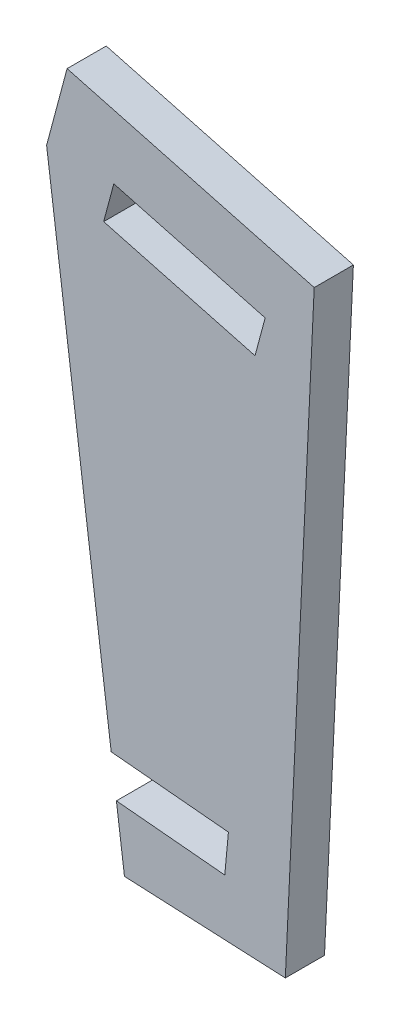
ISO-10303-21;
HEADER;
FILE_DESCRIPTION(('STEP AP214'),'2;1');
FILE_NAME('part.step','',(''),(''),'','','');
FILE_SCHEMA(('AUTOMOTIVE_DESIGN { 1 0 10303 214 1 1 1 1 }'));
ENDSEC;
DATA;
#1=APPLICATION_CONTEXT('core data for automotive mechanical design processes');
#2=APPLICATION_PROTOCOL_DEFINITION('international standard','automotive_design',2000,#1);
#3=PRODUCT_CONTEXT('',#1,'mechanical');
#4=PRODUCT('Part','Part','',(#3));
#5=PRODUCT_RELATED_PRODUCT_CATEGORY('part','',(#4));
#6=PRODUCT_DEFINITION_FORMATION('','',#4);
#7=PRODUCT_DEFINITION_CONTEXT('part definition',#1,'design');
#8=PRODUCT_DEFINITION('design','',#6,#7);
#9=PRODUCT_DEFINITION_SHAPE('','',#8);
#10=(LENGTH_UNIT() NAMED_UNIT(*) SI_UNIT(.MILLI.,.METRE.));
#11=(NAMED_UNIT(*) PLANE_ANGLE_UNIT() SI_UNIT($,.RADIAN.));
#12=(NAMED_UNIT(*) SI_UNIT($,.STERADIAN.) SOLID_ANGLE_UNIT());
#13=UNCERTAINTY_MEASURE_WITH_UNIT(LENGTH_MEASURE(1.E-05),#10,'distance_accuracy_value','');
#14=(GEOMETRIC_REPRESENTATION_CONTEXT(3) GLOBAL_UNCERTAINTY_ASSIGNED_CONTEXT((#13)) GLOBAL_UNIT_ASSIGNED_CONTEXT((#10,
#11,#12)) REPRESENTATION_CONTEXT('',''));
#15=CARTESIAN_POINT('',(0.,0.,0.));
#16=DIRECTION('',(0.,0.,1.));
#17=DIRECTION('',(1.,0.,0.));
#18=AXIS2_PLACEMENT_3D('',#15,#16,#17);
#19=CARTESIAN_POINT('',(157.617642361684,-51.1140319191519,2.99999999999999));
#20=DIRECTION('',(0.,0.,1.));
#21=DIRECTION('',(1.,0.,0.));
#22=AXIS2_PLACEMENT_3D('',#19,#20,#21);
#23=PLANE('',#22);
#24=DIRECTION('',(-0.258148367072537,-0.966105284416654,0.));
#25=VECTOR('',#24,1.);
#26=CARTESIAN_POINT('',(157.617642361684,-51.1140319191519,2.99999999999999));
#27=LINE('',#26,#25);
#28=CARTESIAN_POINT('',(157.617642361684,-51.1140319191519,2.99999999999999));
#29=VERTEX_POINT('',#28);
#30=CARTESIAN_POINT('',(156.049697038007,-56.9819763112041,2.99999999999999));
#31=VERTEX_POINT('',#30);
#32=EDGE_CURVE('E181',#29,#31,#27,.T.);
#33=ORIENTED_EDGE('',*,*,#32,.T.);
#34=DIRECTION('',(0.129889408624981,-0.99152848750152,0.));
#35=VECTOR('',#34,1.);
#36=CARTESIAN_POINT('',(156.049697038007,-56.9819763112041,2.99999999999999));
#37=LINE('',#36,#35);
#38=CARTESIAN_POINT('',(160.995963780606,-94.7399770133879,2.99999999999999));
#39=VERTEX_POINT('',#38);
#40=EDGE_CURVE('E184',#31,#39,#37,.T.);
#41=ORIENTED_EDGE('',*,*,#40,.T.);
#42=DIRECTION('',(0.995686561882044,-0.0927807657196007,0.));
#43=VECTOR('',#42,1.);
#44=CARTESIAN_POINT('',(160.995963780606,-94.7399770133879,2.99999999999999));
#45=LINE('',#44,#43);
#46=CARTESIAN_POINT('',(169.973055579343,-95.5764866971659,3.00000000000001));
#47=VERTEX_POINT('',#46);
#48=EDGE_CURVE('E186',#39,#47,#45,.T.);
#49=ORIENTED_EDGE('',*,*,#48,.T.);
#50=DIRECTION('',(-0.0927807657196038,-0.995686561882043,0.));
#51=VECTOR('',#50,1.);
#52=CARTESIAN_POINT('',(169.973055579343,-95.5764866971659,3.00000000000001));
#53=LINE('',#52,#51);
#54=CARTESIAN_POINT('',(169.694713282184,-98.563546382812,3.00000000000001));
#55=VERTEX_POINT('',#54);
#56=EDGE_CURVE('E188',#47,#55,#53,.T.);
#57=ORIENTED_EDGE('',*,*,#56,.T.);
#58=DIRECTION('',(-0.995686561882044,0.0927807657195996,0.));
#59=VECTOR('',#58,1.);
#60=CARTESIAN_POINT('',(161.395541390582,-97.7902071087678,3.));
#61=LINE('',#60,#59);
#62=CARTESIAN_POINT('',(161.395541390582,-97.7902071087678,3.));
#63=VERTEX_POINT('',#62);
#64=EDGE_CURVE('E190',#55,#63,#61,.T.);
#65=ORIENTED_EDGE('',*,*,#64,.T.);
#66=DIRECTION('',(0.129889408624976,-0.991528487501521,0.));
#67=VECTOR('',#66,1.);
#68=CARTESIAN_POINT('',(161.395541390582,-97.7902071087678,3.));
#69=LINE('',#68,#67);
#70=CARTESIAN_POINT('',(162.011434279497,-102.491709341116,3.));
#71=VERTEX_POINT('',#70);
#72=EDGE_CURVE('E192',#63,#71,#69,.T.);
#73=ORIENTED_EDGE('',*,*,#72,.T.);
#74=DIRECTION('',(0.998889332583097,-0.0471179504190949,0.));
#75=VECTOR('',#74,1.);
#76=CARTESIAN_POINT('',(174.332527403934,-103.072899505041,3.));
#77=LINE('',#76,#75);
#78=CARTESIAN_POINT('',(174.332527403934,-103.072899505041,3.));
#79=VERTEX_POINT('',#78);
#80=EDGE_CURVE('E194',#71,#79,#77,.T.);
#81=ORIENTED_EDGE('',*,*,#80,.T.);
#82=DIRECTION('',(0.0471179504190919,0.998889332583096,0.));
#83=VECTOR('',#82,1.);
#84=CARTESIAN_POINT('',(176.544882918593,-56.171489239557,2.99999999999999));
#85=LINE('',#84,#83);
#86=CARTESIAN_POINT('',(176.544882918593,-56.171489239557,2.99999999999999));
#87=VERTEX_POINT('',#86);
#88=EDGE_CURVE('E196',#79,#87,#85,.T.);
#89=ORIENTED_EDGE('',*,*,#88,.T.);
#90=DIRECTION('',(-0.966105284416654,0.258148367072538,0.));
#91=VECTOR('',#90,1.);
#92=CARTESIAN_POINT('',(157.617642361684,-51.1140319191519,2.99999999999999));
#93=LINE('',#92,#91);
#94=EDGE_CURVE('E198',#87,#29,#93,.T.);
#95=ORIENTED_EDGE('',*,*,#94,.T.);
#96=EDGE_LOOP('',(#33,#41,#49,#57,#65,#73,#81,#89,#95));
#97=FACE_BOUND('',#96,.T.);
#98=DIRECTION('',(0.966105284416653,-0.258148367072539,0.));
#99=VECTOR('',#98,1.);
#100=CARTESIAN_POINT('',(160.419784951868,-59.862246689487,2.99999999999999));
#101=LINE('',#100,#99);
#102=CARTESIAN_POINT('',(160.419784951868,-59.862246689487,2.99999999999999));
#103=VERTEX_POINT('',#102);
#104=CARTESIAN_POINT('',(172.013048364868,-62.9600270943576,3.00000000000001));
#105=VERTEX_POINT('',#104);
#106=EDGE_CURVE('E153',#103,#105,#101,.T.);
#107=ORIENTED_EDGE('',*,*,#106,.F.);
#108=DIRECTION('',(-0.258148367072543,-0.966105284416652,0.));
#109=VECTOR('',#108,1.);
#110=CARTESIAN_POINT('',(161.194230053086,-56.9639308362371,2.99999999999998));
#111=LINE('',#110,#109);
#112=CARTESIAN_POINT('',(161.194230053086,-56.9639308362371,2.99999999999998));
#113=VERTEX_POINT('',#112);
#114=EDGE_CURVE('E142',#113,#103,#111,.T.);
#115=ORIENTED_EDGE('',*,*,#114,.F.);
#116=DIRECTION('',(-0.966105284416653,0.258148367072539,0.));
#117=VECTOR('',#116,1.);
#118=CARTESIAN_POINT('',(172.787493466086,-60.0617112411076,3.00000000000001));
#119=LINE('',#118,#117);
#120=CARTESIAN_POINT('',(172.787493466086,-60.0617112411076,3.00000000000001));
#121=VERTEX_POINT('',#120);
#122=EDGE_CURVE('E157',#121,#113,#119,.T.);
#123=ORIENTED_EDGE('',*,*,#122,.F.);
#124=DIRECTION('',(0.258148367072534,0.966105284416654,0.));
#125=VECTOR('',#124,1.);
#126=CARTESIAN_POINT('',(172.013048364868,-62.9600270943576,3.00000000000001));
#127=LINE('',#126,#125);
#128=EDGE_CURVE('E155',#105,#121,#127,.T.);
#129=ORIENTED_EDGE('',*,*,#128,.F.);
#130=EDGE_LOOP('',(#107,#115,#123,#129));
#131=FACE_BOUND('',#130,.T.);
#132=ADVANCED_FACE('F32',(#97,#131),#23,.T.);
#133=CARTESIAN_POINT('',(157.617642361684,-51.1140319191519,0.));
#134=DIRECTION('',(0.,0.,1.));
#135=DIRECTION('',(1.,0.,0.));
#136=AXIS2_PLACEMENT_3D('',#133,#134,#135);
#137=PLANE('',#136);
#138=DIRECTION('',(-0.258148367072537,-0.966105284416654,0.));
#139=VECTOR('',#138,1.);
#140=CARTESIAN_POINT('',(157.617642361684,-51.1140319191519,0.));
#141=LINE('',#140,#139);
#142=CARTESIAN_POINT('',(157.617642361684,-51.1140319191519,0.));
#143=VERTEX_POINT('',#142);
#144=CARTESIAN_POINT('',(156.049697038007,-56.9819763112042,0.));
#145=VERTEX_POINT('',#144);
#146=EDGE_CURVE('E143',#143,#145,#141,.T.);
#147=ORIENTED_EDGE('',*,*,#146,.F.);
#148=DIRECTION('',(-0.966105284416654,0.258148367072538,0.));
#149=VECTOR('',#148,1.);
#150=CARTESIAN_POINT('',(157.617642361684,-51.1140319191519,0.));
#151=LINE('',#150,#149);
#152=CARTESIAN_POINT('',(176.544882918593,-56.171489239557,0.));
#153=VERTEX_POINT('',#152);
#154=EDGE_CURVE('E179',#153,#143,#151,.T.);
#155=ORIENTED_EDGE('',*,*,#154,.F.);
#156=DIRECTION('',(0.0471179504190919,0.998889332583096,0.));
#157=VECTOR('',#156,1.);
#158=CARTESIAN_POINT('',(176.544882918593,-56.171489239557,0.));
#159=LINE('',#158,#157);
#160=CARTESIAN_POINT('',(174.332527403934,-103.072899505041,0.));
#161=VERTEX_POINT('',#160);
#162=EDGE_CURVE('E177',#161,#153,#159,.T.);
#163=ORIENTED_EDGE('',*,*,#162,.F.);
#164=DIRECTION('',(0.998889332583097,-0.0471179504190949,0.));
#165=VECTOR('',#164,1.);
#166=CARTESIAN_POINT('',(174.332527403934,-103.072899505041,0.));
#167=LINE('',#166,#165);
#168=CARTESIAN_POINT('',(162.011434279497,-102.491709341116,0.));
#169=VERTEX_POINT('',#168);
#170=EDGE_CURVE('E175',#169,#161,#167,.T.);
#171=ORIENTED_EDGE('',*,*,#170,.F.);
#172=DIRECTION('',(0.129889408624976,-0.991528487501521,0.));
#173=VECTOR('',#172,1.);
#174=CARTESIAN_POINT('',(161.395541390582,-97.7902071087678,0.));
#175=LINE('',#174,#173);
#176=CARTESIAN_POINT('',(161.395541390582,-97.7902071087678,0.));
#177=VERTEX_POINT('',#176);
#178=EDGE_CURVE('E173',#177,#169,#175,.T.);
#179=ORIENTED_EDGE('',*,*,#178,.F.);
#180=DIRECTION('',(-0.995686561882044,0.0927807657195996,0.));
#181=VECTOR('',#180,1.);
#182=CARTESIAN_POINT('',(161.395541390582,-97.7902071087678,0.));
#183=LINE('',#182,#181);
#184=CARTESIAN_POINT('',(169.694713282184,-98.563546382812,0.));
#185=VERTEX_POINT('',#184);
#186=EDGE_CURVE('E171',#185,#177,#183,.T.);
#187=ORIENTED_EDGE('',*,*,#186,.F.);
#188=DIRECTION('',(-0.0927807657196038,-0.995686561882043,0.));
#189=VECTOR('',#188,1.);
#190=CARTESIAN_POINT('',(169.973055579343,-95.5764866971659,0.));
#191=LINE('',#190,#189);
#192=CARTESIAN_POINT('',(169.973055579343,-95.5764866971659,0.));
#193=VERTEX_POINT('',#192);
#194=EDGE_CURVE('E169',#193,#185,#191,.T.);
#195=ORIENTED_EDGE('',*,*,#194,.F.);
#196=DIRECTION('',(0.995686561882044,-0.0927807657196007,0.));
#197=VECTOR('',#196,1.);
#198=CARTESIAN_POINT('',(160.995963780606,-94.7399770133879,0.));
#199=LINE('',#198,#197);
#200=CARTESIAN_POINT('',(160.995963780606,-94.7399770133879,0.));
#201=VERTEX_POINT('',#200);
#202=EDGE_CURVE('E167',#201,#193,#199,.T.);
#203=ORIENTED_EDGE('',*,*,#202,.F.);
#204=DIRECTION('',(0.129889408624981,-0.99152848750152,0.));
#205=VECTOR('',#204,1.);
#206=CARTESIAN_POINT('',(156.049697038007,-56.9819763112042,0.));
#207=LINE('',#206,#205);
#208=EDGE_CURVE('E165',#145,#201,#207,.T.);
#209=ORIENTED_EDGE('',*,*,#208,.F.);
#210=EDGE_LOOP('',(#147,#155,#163,#171,#179,#187,#195,#203,#209));
#211=FACE_BOUND('',#210,.T.);
#212=DIRECTION('',(-0.258148367072543,-0.966105284416652,0.));
#213=VECTOR('',#212,1.);
#214=CARTESIAN_POINT('',(161.194230053086,-56.9639308362371,0.));
#215=LINE('',#214,#213);
#216=CARTESIAN_POINT('',(161.194230053086,-56.9639308362371,0.));
#217=VERTEX_POINT('',#216);
#218=CARTESIAN_POINT('',(160.419784951868,-59.862246689487,0.));
#219=VERTEX_POINT('',#218);
#220=EDGE_CURVE('E55',#217,#219,#215,.T.);
#221=ORIENTED_EDGE('',*,*,#220,.T.);
#222=DIRECTION('',(0.966105284416653,-0.258148367072539,0.));
#223=VECTOR('',#222,1.);
#224=CARTESIAN_POINT('',(160.419784951868,-59.862246689487,0.));
#225=LINE('',#224,#223);
#226=CARTESIAN_POINT('',(172.013048364868,-62.9600270943575,0.));
#227=VERTEX_POINT('',#226);
#228=EDGE_CURVE('E129',#219,#227,#225,.T.);
#229=ORIENTED_EDGE('',*,*,#228,.T.);
#230=DIRECTION('',(0.258148367072534,0.966105284416654,0.));
#231=VECTOR('',#230,1.);
#232=CARTESIAN_POINT('',(172.013048364868,-62.9600270943575,0.));
#233=LINE('',#232,#231);
#234=CARTESIAN_POINT('',(172.787493466086,-60.0617112411076,0.));
#235=VERTEX_POINT('',#234);
#236=EDGE_CURVE('E138',#227,#235,#233,.T.);
#237=ORIENTED_EDGE('',*,*,#236,.T.);
#238=DIRECTION('',(-0.966105284416653,0.258148367072539,0.));
#239=VECTOR('',#238,1.);
#240=CARTESIAN_POINT('',(172.787493466086,-60.0617112411076,0.));
#241=LINE('',#240,#239);
#242=EDGE_CURVE('E147',#235,#217,#241,.T.);
#243=ORIENTED_EDGE('',*,*,#242,.T.);
#244=EDGE_LOOP('',(#221,#229,#237,#243));
#245=FACE_BOUND('',#244,.T.);
#246=ADVANCED_FACE('F146',(#211,#245),#137,.F.);
#247=CARTESIAN_POINT('',(157.617642361684,-51.1140319191519,2.99999999999999));
#248=DIRECTION('',(0.966105284416654,-0.258148367072537,0.));
#249=DIRECTION('',(0.258148367072537,0.966105284416653,0.));
#250=AXIS2_PLACEMENT_3D('',#247,#248,#249);
#251=PLANE('',#250);
#252=ORIENTED_EDGE('',*,*,#146,.T.);
#253=DIRECTION('',(0.,0.,-1.));
#254=VECTOR('',#253,1.);
#255=CARTESIAN_POINT('',(156.049697038007,-56.9819763112041,2.99999999999999));
#256=LINE('',#255,#254);
#257=EDGE_CURVE('E11',#31,#145,#256,.T.);
#258=ORIENTED_EDGE('',*,*,#257,.F.);
#259=ORIENTED_EDGE('',*,*,#32,.F.);
#260=DIRECTION('',(0.,0.,-1.));
#261=VECTOR('',#260,1.);
#262=CARTESIAN_POINT('',(157.617642361684,-51.1140319191519,2.99999999999999));
#263=LINE('',#262,#261);
#264=EDGE_CURVE('E200',#29,#143,#263,.T.);
#265=ORIENTED_EDGE('',*,*,#264,.T.);
#266=EDGE_LOOP('',(#252,#258,#259,#265));
#267=FACE_BOUND('',#266,.T.);
#268=ADVANCED_FACE('F34',(#267),#251,.F.);
#269=CARTESIAN_POINT('',(156.049697038007,-56.9819763112041,2.99999999999999));
#270=DIRECTION('',(0.991528487501521,0.129889408624981,0.));
#271=DIRECTION('',(-0.129889408624981,0.99152848750152,0.));
#272=AXIS2_PLACEMENT_3D('',#269,#270,#271);
#273=PLANE('',#272);
#274=ORIENTED_EDGE('',*,*,#208,.T.);
#275=DIRECTION('',(0.,0.,-1.));
#276=VECTOR('',#275,1.);
#277=CARTESIAN_POINT('',(160.995963780606,-94.7399770133879,2.99999999999999));
#278=LINE('',#277,#276);
#279=EDGE_CURVE('E40',#39,#201,#278,.T.);
#280=ORIENTED_EDGE('',*,*,#279,.F.);
#281=ORIENTED_EDGE('',*,*,#40,.F.);
#282=ORIENTED_EDGE('',*,*,#257,.T.);
#283=EDGE_LOOP('',(#274,#280,#281,#282));
#284=FACE_BOUND('',#283,.T.);
#285=ADVANCED_FACE('F247',(#284),#273,.F.);
#286=CARTESIAN_POINT('',(160.995963780606,-94.7399770133879,2.99999999999999));
#287=DIRECTION('',(0.0927807657196009,0.995686561882043,0.));
#288=DIRECTION('',(-0.995686561882044,0.0927807657196008,0.));
#289=AXIS2_PLACEMENT_3D('',#286,#287,#288);
#290=PLANE('',#289);
#291=ORIENTED_EDGE('',*,*,#202,.T.);
#292=DIRECTION('',(0.,0.,-1.));
#293=VECTOR('',#292,1.);
#294=CARTESIAN_POINT('',(169.973055579343,-95.5764866971659,3.00000000000001));
#295=LINE('',#294,#293);
#296=EDGE_CURVE('E218',#47,#193,#295,.T.);
#297=ORIENTED_EDGE('',*,*,#296,.F.);
#298=ORIENTED_EDGE('',*,*,#48,.F.);
#299=ORIENTED_EDGE('',*,*,#279,.T.);
#300=EDGE_LOOP('',(#291,#297,#298,#299));
#301=FACE_BOUND('',#300,.T.);
#302=ADVANCED_FACE('F225',(#301),#290,.F.);
#303=CARTESIAN_POINT('',(169.973055579343,-95.5764866971659,3.00000000000001));
#304=DIRECTION('',(0.995686561882044,-0.0927807657196038,0.));
#305=DIRECTION('',(0.0927807657196038,0.995686561882043,0.));
#306=AXIS2_PLACEMENT_3D('',#303,#304,#305);
#307=PLANE('',#306);
#308=ORIENTED_EDGE('',*,*,#194,.T.);
#309=DIRECTION('',(0.,0.,-1.));
#310=VECTOR('',#309,1.);
#311=CARTESIAN_POINT('',(169.694713282184,-98.563546382812,3.00000000000001));
#312=LINE('',#311,#310);
#313=EDGE_CURVE('E215',#55,#185,#312,.T.);
#314=ORIENTED_EDGE('',*,*,#313,.F.);
#315=ORIENTED_EDGE('',*,*,#56,.F.);
#316=ORIENTED_EDGE('',*,*,#296,.T.);
#317=EDGE_LOOP('',(#308,#314,#315,#316));
#318=FACE_BOUND('',#317,.T.);
#319=ADVANCED_FACE('F235',(#318),#307,.F.);
#320=CARTESIAN_POINT('',(161.395541390582,-97.7902071087678,3.));
#321=DIRECTION('',(-0.0927807657195994,-0.995686561882044,0.));
#322=DIRECTION('',(0.995686561882044,-0.0927807657195996,0.));
#323=AXIS2_PLACEMENT_3D('',#320,#321,#322);
#324=PLANE('',#323);
#325=ORIENTED_EDGE('',*,*,#186,.T.);
#326=DIRECTION('',(0.,0.,-1.));
#327=VECTOR('',#326,1.);
#328=CARTESIAN_POINT('',(161.395541390582,-97.7902071087678,3.));
#329=LINE('',#328,#327);
#330=EDGE_CURVE('E212',#63,#177,#329,.T.);
#331=ORIENTED_EDGE('',*,*,#330,.F.);
#332=ORIENTED_EDGE('',*,*,#64,.F.);
#333=ORIENTED_EDGE('',*,*,#313,.T.);
#334=EDGE_LOOP('',(#325,#331,#332,#333));
#335=FACE_BOUND('',#334,.T.);
#336=ADVANCED_FACE('F239',(#335),#324,.F.);
#337=CARTESIAN_POINT('',(161.395541390582,-97.7902071087678,3.));
#338=DIRECTION('',(0.991528487501521,0.129889408624976,0.));
#339=DIRECTION('',(-0.129889408624976,0.991528487501521,0.));
#340=AXIS2_PLACEMENT_3D('',#337,#338,#339);
#341=PLANE('',#340);
#342=ORIENTED_EDGE('',*,*,#178,.T.);
#343=DIRECTION('',(0.,0.,-1.));
#344=VECTOR('',#343,1.);
#345=CARTESIAN_POINT('',(162.011434279497,-102.491709341116,3.));
#346=LINE('',#345,#344);
#347=EDGE_CURVE('E209',#71,#169,#346,.T.);
#348=ORIENTED_EDGE('',*,*,#347,.F.);
#349=ORIENTED_EDGE('',*,*,#72,.F.);
#350=ORIENTED_EDGE('',*,*,#330,.T.);
#351=EDGE_LOOP('',(#342,#348,#349,#350));
#352=FACE_BOUND('',#351,.T.);
#353=ADVANCED_FACE('F265',(#352),#341,.F.);
#354=CARTESIAN_POINT('',(174.332527403934,-103.072899505041,3.));
#355=DIRECTION('',(0.0471179504190952,0.998889332583096,0.));
#356=DIRECTION('',(-0.998889332583097,0.0471179504190949,0.));
#357=AXIS2_PLACEMENT_3D('',#354,#355,#356);
#358=PLANE('',#357);
#359=ORIENTED_EDGE('',*,*,#170,.T.);
#360=DIRECTION('',(0.,0.,-1.));
#361=VECTOR('',#360,1.);
#362=CARTESIAN_POINT('',(174.332527403934,-103.072899505041,3.));
#363=LINE('',#362,#361);
#364=EDGE_CURVE('E206',#79,#161,#363,.T.);
#365=ORIENTED_EDGE('',*,*,#364,.F.);
#366=ORIENTED_EDGE('',*,*,#80,.F.);
#367=ORIENTED_EDGE('',*,*,#347,.T.);
#368=EDGE_LOOP('',(#359,#365,#366,#367));
#369=FACE_BOUND('',#368,.T.);
#370=ADVANCED_FACE('F263',(#369),#358,.F.);
#371=CARTESIAN_POINT('',(176.544882918593,-56.171489239557,2.99999999999999));
#372=DIRECTION('',(-0.998889332583097,0.0471179504190918,0.));
#373=DIRECTION('',(-0.0471179504190919,-0.998889332583096,0.));
#374=AXIS2_PLACEMENT_3D('',#371,#372,#373);
#375=PLANE('',#374);
#376=ORIENTED_EDGE('',*,*,#162,.T.);
#377=DIRECTION('',(0.,0.,-1.));
#378=VECTOR('',#377,1.);
#379=CARTESIAN_POINT('',(176.544882918593,-56.171489239557,2.99999999999999));
#380=LINE('',#379,#378);
#381=EDGE_CURVE('E203',#87,#153,#380,.T.);
#382=ORIENTED_EDGE('',*,*,#381,.F.);
#383=ORIENTED_EDGE('',*,*,#88,.F.);
#384=ORIENTED_EDGE('',*,*,#364,.T.);
#385=EDGE_LOOP('',(#376,#382,#383,#384));
#386=FACE_BOUND('',#385,.T.);
#387=ADVANCED_FACE('F259',(#386),#375,.F.);
#388=CARTESIAN_POINT('',(157.617642361684,-51.1140319191519,2.99999999999999));
#389=DIRECTION('',(-0.258148367072538,-0.966105284416653,0.));
#390=DIRECTION('',(0.966105284416654,-0.258148367072538,0.));
#391=AXIS2_PLACEMENT_3D('',#388,#389,#390);
#392=PLANE('',#391);
#393=ORIENTED_EDGE('',*,*,#154,.T.);
#394=ORIENTED_EDGE('',*,*,#264,.F.);
#395=ORIENTED_EDGE('',*,*,#94,.F.);
#396=ORIENTED_EDGE('',*,*,#381,.T.);
#397=EDGE_LOOP('',(#393,#394,#395,#396));
#398=FACE_BOUND('',#397,.T.);
#399=ADVANCED_FACE('F254',(#398),#392,.F.);
#400=CARTESIAN_POINT('',(161.194230053086,-56.9639308362371,2.99999999999998));
#401=DIRECTION('',(0.966105284416652,-0.258148367072543,0.));
#402=DIRECTION('',(0.258148367072543,0.966105284416652,0.));
#403=AXIS2_PLACEMENT_3D('',#400,#401,#402);
#404=PLANE('',#403);
#405=ORIENTED_EDGE('',*,*,#220,.F.);
#406=DIRECTION('',(0.,0.,-1.));
#407=VECTOR('',#406,1.);
#408=CARTESIAN_POINT('',(161.194230053086,-56.9639308362371,2.99999999999998));
#409=LINE('',#408,#407);
#410=EDGE_CURVE('E159',#113,#217,#409,.T.);
#411=ORIENTED_EDGE('',*,*,#410,.F.);
#412=ORIENTED_EDGE('',*,*,#114,.T.);
#413=DIRECTION('',(0.,0.,-1.));
#414=VECTOR('',#413,1.);
#415=CARTESIAN_POINT('',(160.419784951868,-59.862246689487,2.99999999999999));
#416=LINE('',#415,#414);
#417=EDGE_CURVE('E131',#103,#219,#416,.T.);
#418=ORIENTED_EDGE('',*,*,#417,.T.);
#419=EDGE_LOOP('',(#405,#411,#412,#418));
#420=FACE_BOUND('',#419,.T.);
#421=ADVANCED_FACE('F140',(#420),#404,.T.);
#422=CARTESIAN_POINT('',(160.419784951868,-59.862246689487,2.99999999999999));
#423=DIRECTION('',(0.258148367072539,0.966105284416653,0.));
#424=DIRECTION('',(-0.966105284416653,0.258148367072539,0.));
#425=AXIS2_PLACEMENT_3D('',#422,#423,#424);
#426=PLANE('',#425);
#427=ORIENTED_EDGE('',*,*,#228,.F.);
#428=ORIENTED_EDGE('',*,*,#417,.F.);
#429=ORIENTED_EDGE('',*,*,#106,.T.);
#430=DIRECTION('',(0.,0.,-1.));
#431=VECTOR('',#430,1.);
#432=CARTESIAN_POINT('',(172.013048364868,-62.9600270943576,3.00000000000001));
#433=LINE('',#432,#431);
#434=EDGE_CURVE('E134',#105,#227,#433,.T.);
#435=ORIENTED_EDGE('',*,*,#434,.T.);
#436=EDGE_LOOP('',(#427,#428,#429,#435));
#437=FACE_BOUND('',#436,.T.);
#438=ADVANCED_FACE('F130',(#437),#426,.T.);
#439=CARTESIAN_POINT('',(172.013048364868,-62.9600270943576,3.00000000000001));
#440=DIRECTION('',(-0.966105284416655,0.258148367072533,0.));
#441=DIRECTION('',(-0.258148367072534,-0.966105284416654,0.));
#442=AXIS2_PLACEMENT_3D('',#439,#440,#441);
#443=PLANE('',#442);
#444=ORIENTED_EDGE('',*,*,#236,.F.);
#445=ORIENTED_EDGE('',*,*,#434,.F.);
#446=ORIENTED_EDGE('',*,*,#128,.T.);
#447=DIRECTION('',(0.,0.,-1.));
#448=VECTOR('',#447,1.);
#449=CARTESIAN_POINT('',(172.787493466086,-60.0617112411076,3.00000000000001));
#450=LINE('',#449,#448);
#451=EDGE_CURVE('E47',#121,#235,#450,.T.);
#452=ORIENTED_EDGE('',*,*,#451,.T.);
#453=EDGE_LOOP('',(#444,#445,#446,#452));
#454=FACE_BOUND('',#453,.T.);
#455=ADVANCED_FACE('F304',(#454),#443,.T.);
#456=CARTESIAN_POINT('',(172.787493466086,-60.0617112411076,3.00000000000001));
#457=DIRECTION('',(-0.258148367072539,-0.966105284416653,0.));
#458=DIRECTION('',(0.966105284416653,-0.258148367072539,0.));
#459=AXIS2_PLACEMENT_3D('',#456,#457,#458);
#460=PLANE('',#459);
#461=ORIENTED_EDGE('',*,*,#242,.F.);
#462=ORIENTED_EDGE('',*,*,#451,.F.);
#463=ORIENTED_EDGE('',*,*,#122,.T.);
#464=ORIENTED_EDGE('',*,*,#410,.T.);
#465=EDGE_LOOP('',(#461,#462,#463,#464));
#466=FACE_BOUND('',#465,.T.);
#467=ADVANCED_FACE('F311',(#466),#460,.T.);
#468=CLOSED_SHELL('',(#132,#246,#268,#285,#302,#319,#336,#353,#370,#387,#399,#421,#438,#455,#467));
#469=MANIFOLD_SOLID_BREP('B2',#468);
#470=ADVANCED_BREP_SHAPE_REPRESENTATION('',(#18,#469),#14);
#471=SHAPE_DEFINITION_REPRESENTATION(#9,#470);
ENDSEC;
END-ISO-10303-21;
